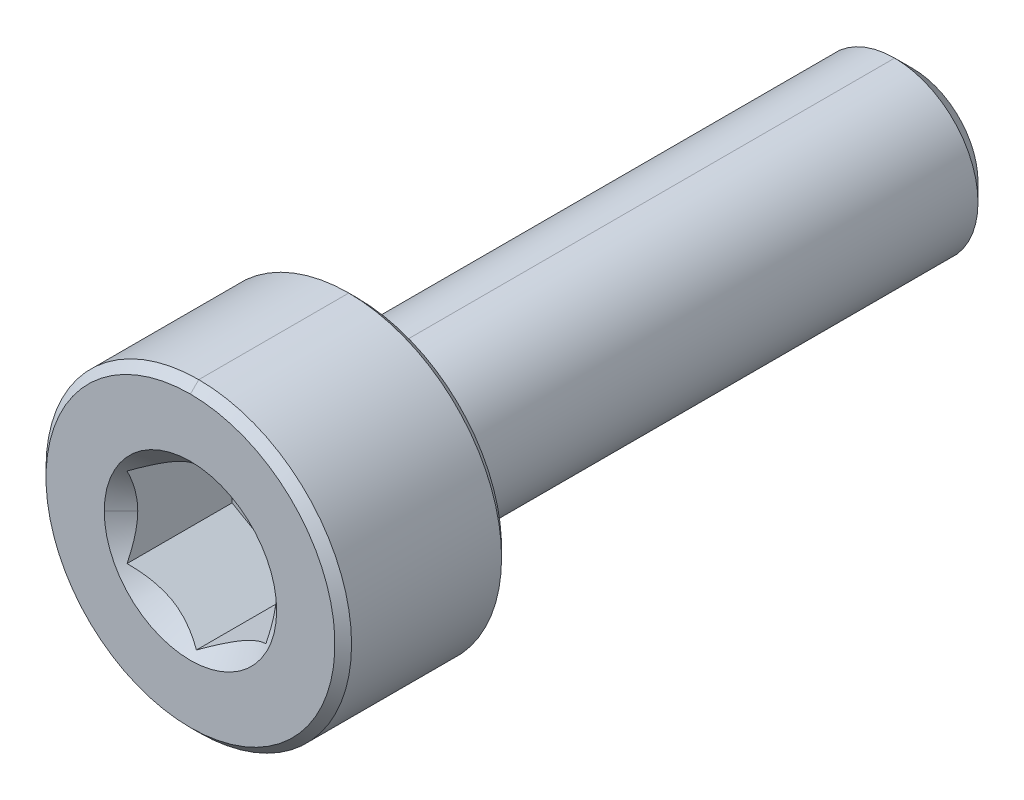
ISO-10303-21;
HEADER;
FILE_DESCRIPTION(('STEP AP214'),'2;1');
FILE_NAME('part.step','',(''),(''),'','','');
FILE_SCHEMA(('AUTOMOTIVE_DESIGN { 1 0 10303 214 1 1 1 1 }'));
ENDSEC;
DATA;
#1=APPLICATION_CONTEXT('core data for automotive mechanical design processes');
#2=APPLICATION_PROTOCOL_DEFINITION('international standard','automotive_design',2000,#1);
#3=PRODUCT_CONTEXT('',#1,'mechanical');
#4=PRODUCT('Part','Part','',(#3));
#5=PRODUCT_RELATED_PRODUCT_CATEGORY('part','',(#4));
#6=PRODUCT_DEFINITION_FORMATION('','',#4);
#7=PRODUCT_DEFINITION_CONTEXT('part definition',#1,'design');
#8=PRODUCT_DEFINITION('design','',#6,#7);
#9=PRODUCT_DEFINITION_SHAPE('','',#8);
#10=(LENGTH_UNIT() NAMED_UNIT(*) SI_UNIT(.MILLI.,.METRE.));
#11=(NAMED_UNIT(*) PLANE_ANGLE_UNIT() SI_UNIT($,.RADIAN.));
#12=(NAMED_UNIT(*) SI_UNIT($,.STERADIAN.) SOLID_ANGLE_UNIT());
#13=UNCERTAINTY_MEASURE_WITH_UNIT(LENGTH_MEASURE(1.E-05),#10,'distance_accuracy_value','');
#14=(GEOMETRIC_REPRESENTATION_CONTEXT(3) GLOBAL_UNCERTAINTY_ASSIGNED_CONTEXT((#13)) GLOBAL_UNIT_ASSIGNED_CONTEXT((#10,
#11,#12)) REPRESENTATION_CONTEXT('',''));
#15=CARTESIAN_POINT('',(0.,0.,0.));
#16=DIRECTION('',(0.,0.,1.));
#17=DIRECTION('',(1.,0.,0.));
#18=AXIS2_PLACEMENT_3D('',#15,#16,#17);
#19=CARTESIAN_POINT('',(1.25,-0.721687836487032,-0.318813079129866));
#20=DIRECTION('',(1.,0.,0.));
#21=DIRECTION('',(0.,-1.,0.));
#22=AXIS2_PLACEMENT_3D('',#19,#20,#21);
#23=PLANE('',#22);
#24=DIRECTION('',(0.,0.,1.));
#25=VECTOR('',#24,1.);
#26=CARTESIAN_POINT('',(1.25,-0.721687836487032,-0.318813079129866));
#27=LINE('',#26,#25);
#28=CARTESIAN_POINT('',(1.25,-0.721687836487032,4.5));
#29=VERTEX_POINT('',#28);
#30=CARTESIAN_POINT('',(1.25,-0.721687836487032,6.39174682452695));
#31=VERTEX_POINT('',#30);
#32=EDGE_CURVE('E467',#29,#31,#27,.T.);
#33=ORIENTED_EDGE('',*,*,#32,.T.);
#34=CARTESIAN_POINT('',(1.25,-0.721687836487032,6.39174682452694));
#35=CARTESIAN_POINT('',(1.25,-0.334936490538911,6.19837115155288));
#36=CARTESIAN_POINT('',(1.25,0.,6.19837115155288));
#37=B_SPLINE_CURVE_WITH_KNOTS('',2,(#34,#35,#36),.UNSPECIFIED.,.F.,.F.,(3,3),(0.,1.),.UNSPECIFIED.);
#38=CARTESIAN_POINT('',(1.25,0.,6.19837115155288));
#39=VERTEX_POINT('',#38);
#40=EDGE_CURVE('E470',#31,#39,#37,.T.);
#41=ORIENTED_EDGE('',*,*,#40,.T.);
#42=CARTESIAN_POINT('',(1.25,0.,6.19837115155288));
#43=CARTESIAN_POINT('',(1.25,0.180809106046994,6.19837115155288));
#44=CARTESIAN_POINT('',(1.25,0.371449563482302,6.25239368901567));
#45=CARTESIAN_POINT('',(1.25,0.536554357052858,6.29918008480986));
#46=CARTESIAN_POINT('',(1.25,0.721687836487032,6.39174682452694));
#47=B_SPLINE_CURVE_WITH_KNOTS('',2,(#42,#43,#44,#45,#46),.UNSPECIFIED.,.F.,.F.,(3,2,3),(0.,0.5,
1.),.UNSPECIFIED.);
#48=CARTESIAN_POINT('',(1.25,0.721687836487032,6.39174682452695));
#49=VERTEX_POINT('',#48);
#50=EDGE_CURVE('E269',#39,#49,#47,.T.);
#51=ORIENTED_EDGE('',*,*,#50,.T.);
#52=DIRECTION('',(0.,0.,1.));
#53=VECTOR('',#52,1.);
#54=CARTESIAN_POINT('',(1.25,0.721687836487032,-0.318813079129866));
#55=LINE('',#54,#53);
#56=CARTESIAN_POINT('',(1.25,0.721687836487032,4.5));
#57=VERTEX_POINT('',#56);
#58=EDGE_CURVE('E10',#57,#49,#55,.T.);
#59=ORIENTED_EDGE('',*,*,#58,.F.);
#60=DIRECTION('',(0.,1.,0.));
#61=VECTOR('',#60,1.);
#62=CARTESIAN_POINT('',(1.25,-0.721687836487032,4.5));
#63=LINE('',#62,#61);
#64=EDGE_CURVE('E268',#29,#57,#63,.T.);
#65=ORIENTED_EDGE('',*,*,#64,.F.);
#66=EDGE_LOOP('',(#33,#41,#51,#59,#65));
#67=FACE_BOUND('',#66,.T.);
#68=ADVANCED_FACE('F15',(#67),#23,.F.);
#69=CARTESIAN_POINT('',(1.25,0.721687836487032,-0.318813079129866));
#70=DIRECTION('',(0.5,0.866025403784439,0.));
#71=DIRECTION('',(0.,0.,-1.));
#72=AXIS2_PLACEMENT_3D('',#69,#70,#71);
#73=PLANE('',#72);
#74=ORIENTED_EDGE('',*,*,#58,.T.);
#75=CARTESIAN_POINT('',(1.25,0.721687836487032,6.39174682452694));
#76=CARTESIAN_POINT('',(0.91656068727862,0.914199113445125,6.19923554756885));
#77=CARTESIAN_POINT('',(0.627302735621754,1.08120226969946,6.19837397959836));
#78=CARTESIAN_POINT('',(0.336432191071432,1.24913645689492,6.19750760844657));
#79=CARTESIAN_POINT('',(0.,1.44337567297406,6.39174682452694));
#80=B_SPLINE_CURVE_WITH_KNOTS('',2,(#75,#76,#77,#78,#79),.UNSPECIFIED.,.F.,.F.,(3,2,3),(0.,0.5,
1.),.UNSPECIFIED.);
#81=CARTESIAN_POINT('',(0.,1.44337567297406,6.39174682452695));
#82=VERTEX_POINT('',#81);
#83=EDGE_CURVE('E610',#49,#82,#80,.T.);
#84=ORIENTED_EDGE('',*,*,#83,.T.);
#85=DIRECTION('',(0.,0.,1.));
#86=VECTOR('',#85,1.);
#87=CARTESIAN_POINT('',(0.,1.44337567297406,-0.318813079129866));
#88=LINE('',#87,#86);
#89=CARTESIAN_POINT('',(0.,1.44337567297406,4.5));
#90=VERTEX_POINT('',#89);
#91=EDGE_CURVE('E27',#90,#82,#88,.T.);
#92=ORIENTED_EDGE('',*,*,#91,.F.);
#93=DIRECTION('',(-0.866025403784439,0.5,0.));
#94=VECTOR('',#93,1.);
#95=CARTESIAN_POINT('',(1.25,0.721687836487032,4.5));
#96=LINE('',#95,#94);
#97=EDGE_CURVE('E284',#57,#90,#96,.T.);
#98=ORIENTED_EDGE('',*,*,#97,.F.);
#99=EDGE_LOOP('',(#74,#84,#92,#98));
#100=FACE_BOUND('',#99,.T.);
#101=ADVANCED_FACE('F461',(#100),#73,.F.);
#102=CARTESIAN_POINT('',(0.,1.44337567297406,-0.318813079129866));
#103=DIRECTION('',(-0.5,0.866025403784439,0.));
#104=DIRECTION('',(0.,0.,1.));
#105=AXIS2_PLACEMENT_3D('',#102,#103,#104);
#106=PLANE('',#105);
#107=ORIENTED_EDGE('',*,*,#91,.T.);
#108=CARTESIAN_POINT('',(0.,1.44337567297406,6.39174682452694));
#109=CARTESIAN_POINT('',(-0.333439312720455,1.25086439601651,6.19923554756939));
#110=CARTESIAN_POINT('',(-0.622697264378245,1.08386123976164,6.19837397959836));
#111=CARTESIAN_POINT('',(-0.913567808927629,0.915927052566721,6.19750760844603));
#112=CARTESIAN_POINT('',(-1.25,0.721687836487032,6.39174682452694));
#113=B_SPLINE_CURVE_WITH_KNOTS('',2,(#108,#109,#110,#111,#112),.UNSPECIFIED.,.F.,.F.,(3,2,3),
(0.,0.5,1.),.UNSPECIFIED.);
#114=CARTESIAN_POINT('',(-1.25,0.721687836487032,6.39174682452695));
#115=VERTEX_POINT('',#114);
#116=EDGE_CURVE('E605',#82,#115,#113,.T.);
#117=ORIENTED_EDGE('',*,*,#116,.T.);
#118=DIRECTION('',(0.,0.,1.));
#119=VECTOR('',#118,1.);
#120=CARTESIAN_POINT('',(-1.25,0.721687836487032,-0.318813079129866));
#121=LINE('',#120,#119);
#122=CARTESIAN_POINT('',(-1.25,0.721687836487032,4.5));
#123=VERTEX_POINT('',#122);
#124=EDGE_CURVE('E52',#123,#115,#121,.T.);
#125=ORIENTED_EDGE('',*,*,#124,.F.);
#126=DIRECTION('',(-0.866025403784439,-0.5,0.));
#127=VECTOR('',#126,1.);
#128=CARTESIAN_POINT('',(0.,1.44337567297406,4.5));
#129=LINE('',#128,#127);
#130=EDGE_CURVE('E290',#90,#123,#129,.T.);
#131=ORIENTED_EDGE('',*,*,#130,.F.);
#132=EDGE_LOOP('',(#107,#117,#125,#131));
#133=FACE_BOUND('',#132,.T.);
#134=ADVANCED_FACE('F373',(#133),#106,.F.);
#135=CARTESIAN_POINT('',(-1.25,0.721687836487032,-0.318813079129866));
#136=DIRECTION('',(-1.,0.,0.));
#137=DIRECTION('',(0.,1.,0.));
#138=AXIS2_PLACEMENT_3D('',#135,#136,#137);
#139=PLANE('',#138);
#140=ORIENTED_EDGE('',*,*,#124,.T.);
#141=CARTESIAN_POINT('',(-1.25,0.721687836487032,6.39174682452694));
#142=CARTESIAN_POINT('',(-1.25,0.538824359635309,6.30031508610108));
#143=CARTESIAN_POINT('',(-1.25,0.371449563482303,6.25239368901567));
#144=CARTESIAN_POINT('',(-1.25,0.182765348383379,6.19837115155288));
#145=CARTESIAN_POINT('',(-1.25,0.,6.19837115155288));
#146=B_SPLINE_CURVE_WITH_KNOTS('',2,(#141,#142,#143,#144,#145),.UNSPECIFIED.,.F.,.F.,(3,2,3),
(0.,0.5,1.),.UNSPECIFIED.);
#147=CARTESIAN_POINT('',(-1.25,0.,6.19837115155288));
#148=VERTEX_POINT('',#147);
#149=EDGE_CURVE('E280',#115,#148,#146,.T.);
#150=ORIENTED_EDGE('',*,*,#149,.T.);
#151=CARTESIAN_POINT('',(-1.25,0.,6.19837115155288));
#152=CARTESIAN_POINT('',(-1.25,-0.33493649053891,6.19837115155288));
#153=CARTESIAN_POINT('',(-1.25,-0.721687836487032,6.39174682452694));
#154=B_SPLINE_CURVE_WITH_KNOTS('',2,(#151,#152,#153),.UNSPECIFIED.,.F.,.F.,(3,3),(0.,1.),.UNSPECIFIED.);
#155=CARTESIAN_POINT('',(-1.25,-0.721687836487032,6.39174682452695));
#156=VERTEX_POINT('',#155);
#157=EDGE_CURVE('E392',#148,#156,#154,.T.);
#158=ORIENTED_EDGE('',*,*,#157,.T.);
#159=DIRECTION('',(0.,0.,1.));
#160=VECTOR('',#159,1.);
#161=CARTESIAN_POINT('',(-1.25,-0.721687836487032,-0.318813079129866));
#162=LINE('',#161,#160);
#163=CARTESIAN_POINT('',(-1.25,-0.721687836487033,4.5));
#164=VERTEX_POINT('',#163);
#165=EDGE_CURVE('E41',#164,#156,#162,.T.);
#166=ORIENTED_EDGE('',*,*,#165,.F.);
#167=DIRECTION('',(0.,-1.,0.));
#168=VECTOR('',#167,1.);
#169=CARTESIAN_POINT('',(-1.25,0.721687836487032,4.5));
#170=LINE('',#169,#168);
#171=EDGE_CURVE('E285',#123,#164,#170,.T.);
#172=ORIENTED_EDGE('',*,*,#171,.F.);
#173=EDGE_LOOP('',(#140,#150,#158,#166,#172));
#174=FACE_BOUND('',#173,.T.);
#175=ADVANCED_FACE('F363',(#174),#139,.F.);
#176=CARTESIAN_POINT('',(-1.25,-0.721687836487032,-0.318813079129866));
#177=DIRECTION('',(-0.5,-0.866025403784439,0.));
#178=DIRECTION('',(-0.866025403784439,0.5,0.));
#179=AXIS2_PLACEMENT_3D('',#176,#177,#178);
#180=PLANE('',#179);
#181=ORIENTED_EDGE('',*,*,#165,.T.);
#182=CARTESIAN_POINT('',(-1.25,-0.721687836487032,6.39174682452695));
#183=CARTESIAN_POINT('',(-0.916560687277681,-0.914199113445667,6.19923554756832));
#184=CARTESIAN_POINT('',(-0.627302735621755,-1.08120226969945,6.19837397959838));
#185=CARTESIAN_POINT('',(-0.336432191070502,-1.24913645689545,6.19750760844712));
#186=CARTESIAN_POINT('',(0.,-1.44337567297406,6.39174682452695));
#187=B_SPLINE_CURVE_WITH_KNOTS('',2,(#182,#183,#184,#185,#186),.UNSPECIFIED.,.F.,.F.,(3,2,3),
(0.,0.5,1.),.UNSPECIFIED.);
#188=CARTESIAN_POINT('',(0.,-1.44337567297406,6.39174682452695));
#189=VERTEX_POINT('',#188);
#190=EDGE_CURVE('E398',#156,#189,#187,.T.);
#191=ORIENTED_EDGE('',*,*,#190,.T.);
#192=DIRECTION('',(0.,0.,1.));
#193=VECTOR('',#192,1.);
#194=CARTESIAN_POINT('',(0.,-1.44337567297406,-0.318813079129866));
#195=LINE('',#194,#193);
#196=CARTESIAN_POINT('',(0.,-1.44337567297406,4.5));
#197=VERTEX_POINT('',#196);
#198=EDGE_CURVE('E294',#197,#189,#195,.T.);
#199=ORIENTED_EDGE('',*,*,#198,.F.);
#200=DIRECTION('',(0.866025403784439,-0.5,0.));
#201=VECTOR('',#200,1.);
#202=CARTESIAN_POINT('',(-1.25,-0.721687836487032,4.5));
#203=LINE('',#202,#201);
#204=EDGE_CURVE('E289',#164,#197,#203,.T.);
#205=ORIENTED_EDGE('',*,*,#204,.F.);
#206=EDGE_LOOP('',(#181,#191,#199,#205));
#207=FACE_BOUND('',#206,.T.);
#208=ADVANCED_FACE('F372',(#207),#180,.F.);
#209=CARTESIAN_POINT('',(0.,-1.44337567297406,-0.318813079129866));
#210=DIRECTION('',(0.5,-0.866025403784439,0.));
#211=DIRECTION('',(0.,0.,-1.));
#212=AXIS2_PLACEMENT_3D('',#209,#210,#211);
#213=PLANE('',#212);
#214=ORIENTED_EDGE('',*,*,#198,.T.);
#215=CARTESIAN_POINT('',(0.,-1.44337567297406,6.39174682452694));
#216=CARTESIAN_POINT('',(0.33343931272232,-1.25086439601543,6.19923554756831));
#217=CARTESIAN_POINT('',(0.622697264378245,-1.08386123976164,6.19837397959836));
#218=CARTESIAN_POINT('',(0.9135678089295,-0.915927052565641,6.1975076084471));
#219=CARTESIAN_POINT('',(1.25,-0.721687836487032,6.39174682452694));
#220=B_SPLINE_CURVE_WITH_KNOTS('',2,(#215,#216,#217,#218,#219),.UNSPECIFIED.,.F.,.F.,(3,2,3),
(0.,0.5,1.),.UNSPECIFIED.);
#221=EDGE_CURVE('E477',#189,#31,#220,.T.);
#222=ORIENTED_EDGE('',*,*,#221,.T.);
#223=ORIENTED_EDGE('',*,*,#32,.F.);
#224=DIRECTION('',(0.866025403784439,0.5,0.));
#225=VECTOR('',#224,1.);
#226=CARTESIAN_POINT('',(0.,-1.44337567297406,4.5));
#227=LINE('',#226,#225);
#228=EDGE_CURVE('E264',#197,#29,#227,.T.);
#229=ORIENTED_EDGE('',*,*,#228,.F.);
#230=EDGE_LOOP('',(#214,#222,#223,#229));
#231=FACE_BOUND('',#230,.T.);
#232=ADVANCED_FACE('F374',(#231),#213,.F.);
#233=CARTESIAN_POINT('',(0.,2.6,4.5));
#234=DIRECTION('',(0.,0.,-1.));
#235=DIRECTION('',(-1.,0.,0.));
#236=AXIS2_PLACEMENT_3D('',#233,#234,#235);
#237=PLANE('',#236);
#238=ORIENTED_EDGE('',*,*,#228,.T.);
#239=ORIENTED_EDGE('',*,*,#64,.T.);
#240=ORIENTED_EDGE('',*,*,#97,.T.);
#241=ORIENTED_EDGE('',*,*,#130,.T.);
#242=ORIENTED_EDGE('',*,*,#171,.T.);
#243=ORIENTED_EDGE('',*,*,#204,.T.);
#244=EDGE_LOOP('',(#238,#239,#240,#241,#242,#243));
#245=FACE_BOUND('',#244,.T.);
#246=ADVANCED_FACE('F328',(#245),#237,.F.);
#247=CARTESIAN_POINT('',(0.,0.,6.5));
#248=DIRECTION('',(0.,0.,1.));
#249=DIRECTION('',(1.,0.,0.));
#250=AXIS2_PLACEMENT_3D('',#247,#248,#249);
#251=CONICAL_SURFACE('',#250,1.55162884844712,0.78539816339745);
#252=DIRECTION('',(-0.707106781186549,0.,0.707106781186546));
#253=VECTOR('',#252,1.);
#254=CARTESIAN_POINT('',(-1.55162884844712,0.,6.5));
#255=LINE('',#254,#253);
#256=CARTESIAN_POINT('',(-1.55162884844712,0.,6.5));
#257=VERTEX_POINT('',#256);
#258=EDGE_CURVE('E395',#148,#257,#255,.T.);
#259=ORIENTED_EDGE('',*,*,#258,.F.);
#260=ORIENTED_EDGE('',*,*,#149,.F.);
#261=ORIENTED_EDGE('',*,*,#116,.F.);
#262=ORIENTED_EDGE('',*,*,#83,.F.);
#263=ORIENTED_EDGE('',*,*,#50,.F.);
#264=DIRECTION('',(0.707106781186549,0.,0.707106781186546));
#265=VECTOR('',#264,1.);
#266=CARTESIAN_POINT('',(1.55162884844712,0.,6.5));
#267=LINE('',#266,#265);
#268=CARTESIAN_POINT('',(1.55162884844712,0.,6.5));
#269=VERTEX_POINT('',#268);
#270=EDGE_CURVE('E315',#39,#269,#267,.T.);
#271=ORIENTED_EDGE('',*,*,#270,.T.);
#272=CARTESIAN_POINT('',(0.,0.,6.5));
#273=DIRECTION('',(0.,0.,1.));
#274=DIRECTION('',(1.,0.,0.));
#275=AXIS2_PLACEMENT_3D('',#272,#273,#274);
#276=CIRCLE('',#275,1.55162884844712);
#277=EDGE_CURVE('E277',#269,#257,#276,.T.);
#278=ORIENTED_EDGE('',*,*,#277,.T.);
#279=EDGE_LOOP('',(#259,#260,#261,#262,#263,#271,#278));
#280=FACE_BOUND('',#279,.T.);
#281=ADVANCED_FACE('F317',(#280),#251,.F.);
#282=CARTESIAN_POINT('',(0.,0.,6.5));
#283=DIRECTION('',(0.,0.,1.));
#284=DIRECTION('',(0.,-1.,0.));
#285=AXIS2_PLACEMENT_3D('',#282,#283,#284);
#286=PLANE('',#285);
#287=ORIENTED_EDGE('',*,*,#277,.F.);
#288=CARTESIAN_POINT('',(0.,0.,6.5));
#289=DIRECTION('',(0.,0.,1.));
#290=DIRECTION('',(1.,0.,0.));
#291=AXIS2_PLACEMENT_3D('',#288,#289,#290);
#292=CIRCLE('',#291,1.55162884844712);
#293=EDGE_CURVE('E406',#257,#269,#292,.T.);
#294=ORIENTED_EDGE('',*,*,#293,.F.);
#295=EDGE_LOOP('',(#287,#294));
#296=FACE_BOUND('',#295,.T.);
#297=CARTESIAN_POINT('',(0.,0.,6.5));
#298=DIRECTION('',(0.,0.,-1.));
#299=DIRECTION('',(0.,1.,0.));
#300=AXIS2_PLACEMENT_3D('',#297,#298,#299);
#301=CIRCLE('',#300,2.6);
#302=CARTESIAN_POINT('',(0.,2.6,6.5));
#303=VERTEX_POINT('',#302);
#304=CARTESIAN_POINT('',(0.,-2.6,6.5));
#305=VERTEX_POINT('',#304);
#306=EDGE_CURVE('E1045',#303,#305,#301,.T.);
#307=ORIENTED_EDGE('',*,*,#306,.F.);
#308=CARTESIAN_POINT('',(0.,0.,6.5));
#309=DIRECTION('',(0.,0.,-1.));
#310=DIRECTION('',(0.,1.,0.));
#311=AXIS2_PLACEMENT_3D('',#308,#309,#310);
#312=CIRCLE('',#311,2.6);
#313=EDGE_CURVE('E276',#305,#303,#312,.T.);
#314=ORIENTED_EDGE('',*,*,#313,.F.);
#315=EDGE_LOOP('',(#307,#314));
#316=FACE_BOUND('',#315,.T.);
#317=ADVANCED_FACE('F327',(#296,#316),#286,.T.);
#318=CARTESIAN_POINT('',(0.,0.,6.35));
#319=DIRECTION('',(0.,0.,-1.));
#320=DIRECTION('',(0.,1.,0.));
#321=AXIS2_PLACEMENT_3D('',#318,#319,#320);
#322=CONICAL_SURFACE('',#321,2.75,0.785398163397451);
#323=DIRECTION('',(0.,-0.70710678118655,-0.707106781186546));
#324=VECTOR('',#323,1.);
#325=CARTESIAN_POINT('',(0.,-2.75,6.35));
#326=LINE('',#325,#324);
#327=CARTESIAN_POINT('',(0.,-2.75,6.35));
#328=VERTEX_POINT('',#327);
#329=EDGE_CURVE('E1048',#305,#328,#326,.T.);
#330=ORIENTED_EDGE('',*,*,#329,.F.);
#331=ORIENTED_EDGE('',*,*,#313,.T.);
#332=DIRECTION('',(0.,0.70710678118655,-0.707106781186546));
#333=VECTOR('',#332,1.);
#334=CARTESIAN_POINT('',(0.,2.75,6.35));
#335=LINE('',#334,#333);
#336=CARTESIAN_POINT('',(0.,2.75,6.35));
#337=VERTEX_POINT('',#336);
#338=EDGE_CURVE('E211',#303,#337,#335,.T.);
#339=ORIENTED_EDGE('',*,*,#338,.T.);
#340=CARTESIAN_POINT('',(0.,0.,6.35));
#341=DIRECTION('',(0.,0.,-1.));
#342=DIRECTION('',(0.,1.,0.));
#343=AXIS2_PLACEMENT_3D('',#340,#341,#342);
#344=CIRCLE('',#343,2.75);
#345=EDGE_CURVE('E187',#328,#337,#344,.T.);
#346=ORIENTED_EDGE('',*,*,#345,.F.);
#347=EDGE_LOOP('',(#330,#331,#339,#346));
#348=FACE_BOUND('',#347,.T.);
#349=ADVANCED_FACE('F449',(#348),#322,.T.);
#350=CARTESIAN_POINT('',(0.,0.,-6.5));
#351=DIRECTION('',(0.,0.,-1.));
#352=DIRECTION('',(0.,1.,0.));
#353=AXIS2_PLACEMENT_3D('',#350,#351,#352);
#354=CYLINDRICAL_SURFACE('',#353,2.75);
#355=DIRECTION('',(0.,0.,-1.));
#356=VECTOR('',#355,1.);
#357=CARTESIAN_POINT('',(0.,-2.75,-6.5));
#358=LINE('',#357,#356);
#359=CARTESIAN_POINT('',(0.,-2.75,3.65));
#360=VERTEX_POINT('',#359);
#361=EDGE_CURVE('E178',#328,#360,#358,.T.);
#362=ORIENTED_EDGE('',*,*,#361,.F.);
#363=ORIENTED_EDGE('',*,*,#345,.T.);
#364=DIRECTION('',(0.,0.,-1.));
#365=VECTOR('',#364,1.);
#366=CARTESIAN_POINT('',(0.,2.75,-6.5));
#367=LINE('',#366,#365);
#368=CARTESIAN_POINT('',(0.,2.75,3.65));
#369=VERTEX_POINT('',#368);
#370=EDGE_CURVE('E181',#337,#369,#367,.T.);
#371=ORIENTED_EDGE('',*,*,#370,.T.);
#372=CARTESIAN_POINT('',(0.,0.,3.65));
#373=DIRECTION('',(0.,0.,-1.));
#374=DIRECTION('',(0.,1.,0.));
#375=AXIS2_PLACEMENT_3D('',#372,#373,#374);
#376=CIRCLE('',#375,2.75);
#377=EDGE_CURVE('E174',#360,#369,#376,.T.);
#378=ORIENTED_EDGE('',*,*,#377,.F.);
#379=EDGE_LOOP('',(#362,#363,#371,#378));
#380=FACE_BOUND('',#379,.T.);
#381=ADVANCED_FACE('F176',(#380),#354,.T.);
#382=CARTESIAN_POINT('',(0.,0.,3.5));
#383=DIRECTION('',(0.,0.,1.));
#384=DIRECTION('',(0.,-1.,0.));
#385=AXIS2_PLACEMENT_3D('',#382,#383,#384);
#386=CONICAL_SURFACE('',#385,2.6,0.785398163397446);
#387=DIRECTION('',(0.,0.707106781186546,0.70710678118655));
#388=VECTOR('',#387,1.);
#389=CARTESIAN_POINT('',(0.,2.6,3.5));
#390=LINE('',#389,#388);
#391=CARTESIAN_POINT('',(0.,2.6,3.5));
#392=VERTEX_POINT('',#391);
#393=EDGE_CURVE('E199',#392,#369,#390,.T.);
#394=ORIENTED_EDGE('',*,*,#393,.F.);
#395=CARTESIAN_POINT('',(0.,0.,3.5));
#396=DIRECTION('',(0.,0.,-1.));
#397=DIRECTION('',(0.,1.,0.));
#398=AXIS2_PLACEMENT_3D('',#395,#396,#397);
#399=CIRCLE('',#398,2.6);
#400=CARTESIAN_POINT('',(0.,-2.6,3.5));
#401=VERTEX_POINT('',#400);
#402=EDGE_CURVE('E188',#401,#392,#399,.T.);
#403=ORIENTED_EDGE('',*,*,#402,.F.);
#404=DIRECTION('',(0.,-0.707106781186546,0.70710678118655));
#405=VECTOR('',#404,1.);
#406=CARTESIAN_POINT('',(0.,-2.6,3.5));
#407=LINE('',#406,#405);
#408=EDGE_CURVE('E191',#401,#360,#407,.T.);
#409=ORIENTED_EDGE('',*,*,#408,.T.);
#410=ORIENTED_EDGE('',*,*,#377,.T.);
#411=EDGE_LOOP('',(#394,#403,#409,#410));
#412=FACE_BOUND('',#411,.T.);
#413=ADVANCED_FACE('F193',(#412),#386,.T.);
#414=CARTESIAN_POINT('',(0.,2.6,3.5));
#415=DIRECTION('',(0.,0.,-1.));
#416=DIRECTION('',(-1.,0.,0.));
#417=AXIS2_PLACEMENT_3D('',#414,#415,#416);
#418=PLANE('',#417);
#419=CARTESIAN_POINT('',(0.,0.,3.5));
#420=DIRECTION('',(0.,0.,-1.));
#421=DIRECTION('',(0.,1.,0.));
#422=AXIS2_PLACEMENT_3D('',#419,#420,#421);
#423=CIRCLE('',#422,1.65);
#424=CARTESIAN_POINT('',(0.,1.65,3.5));
#425=VERTEX_POINT('',#424);
#426=CARTESIAN_POINT('',(0.,-1.65,3.5));
#427=VERTEX_POINT('',#426);
#428=EDGE_CURVE('E263',#425,#427,#423,.T.);
#429=ORIENTED_EDGE('',*,*,#428,.F.);
#430=CARTESIAN_POINT('',(0.,0.,3.5));
#431=DIRECTION('',(0.,0.,-1.));
#432=DIRECTION('',(0.,1.,0.));
#433=AXIS2_PLACEMENT_3D('',#430,#431,#432);
#434=CIRCLE('',#433,1.65);
#435=EDGE_CURVE('E222',#427,#425,#434,.T.);
#436=ORIENTED_EDGE('',*,*,#435,.F.);
#437=EDGE_LOOP('',(#429,#436));
#438=FACE_BOUND('',#437,.T.);
#439=ORIENTED_EDGE('',*,*,#402,.T.);
#440=CARTESIAN_POINT('',(0.,0.,3.5));
#441=DIRECTION('',(0.,0.,-1.));
#442=DIRECTION('',(0.,1.,0.));
#443=AXIS2_PLACEMENT_3D('',#440,#441,#442);
#444=CIRCLE('',#443,2.6);
#445=EDGE_CURVE('E542',#392,#401,#444,.T.);
#446=ORIENTED_EDGE('',*,*,#445,.T.);
#447=EDGE_LOOP('',(#439,#446));
#448=FACE_BOUND('',#447,.T.);
#449=ADVANCED_FACE('F437',(#438,#448),#418,.T.);
#450=CARTESIAN_POINT('',(0.,0.,3.35));
#451=DIRECTION('',(0.,0.,-1.));
#452=DIRECTION('',(0.,1.,0.));
#453=AXIS2_PLACEMENT_3D('',#450,#451,#452);
#454=TOROIDAL_SURFACE('',#453,1.65,0.15);
#455=CARTESIAN_POINT('',(0.,-1.65,3.35));
#456=DIRECTION('',(1.,0.,0.));
#457=DIRECTION('',(0.,1.,0.));
#458=AXIS2_PLACEMENT_3D('',#455,#456,#457);
#459=CIRCLE('',#458,0.15);
#460=CARTESIAN_POINT('',(0.,-1.5,3.35));
#461=VERTEX_POINT('',#460);
#462=EDGE_CURVE('E227',#461,#427,#459,.T.);
#463=ORIENTED_EDGE('',*,*,#462,.F.);
#464=CARTESIAN_POINT('',(0.,0.,3.35));
#465=DIRECTION('',(0.,0.,-1.));
#466=DIRECTION('',(0.,1.,0.));
#467=AXIS2_PLACEMENT_3D('',#464,#465,#466);
#468=CIRCLE('',#467,1.5);
#469=CARTESIAN_POINT('',(0.,1.5,3.35));
#470=VERTEX_POINT('',#469);
#471=EDGE_CURVE('E231',#470,#461,#468,.T.);
#472=ORIENTED_EDGE('',*,*,#471,.F.);
#473=CARTESIAN_POINT('',(0.,1.65,3.35));
#474=DIRECTION('',(-1.,0.,0.));
#475=DIRECTION('',(0.,0.,1.));
#476=AXIS2_PLACEMENT_3D('',#473,#474,#475);
#477=CIRCLE('',#476,0.15);
#478=EDGE_CURVE('E226',#470,#425,#477,.T.);
#479=ORIENTED_EDGE('',*,*,#478,.T.);
#480=ORIENTED_EDGE('',*,*,#428,.T.);
#481=EDGE_LOOP('',(#463,#472,#479,#480));
#482=FACE_BOUND('',#481,.T.);
#483=ADVANCED_FACE('F442',(#482),#454,.F.);
#484=CARTESIAN_POINT('',(0.,0.,-6.5));
#485=DIRECTION('',(0.,0.,-1.));
#486=DIRECTION('',(0.,1.,0.));
#487=AXIS2_PLACEMENT_3D('',#484,#485,#486);
#488=CYLINDRICAL_SURFACE('',#487,1.5);
#489=DIRECTION('',(0.,0.,-1.));
#490=VECTOR('',#489,1.);
#491=CARTESIAN_POINT('',(0.,-1.5,-6.5));
#492=LINE('',#491,#490);
#493=CARTESIAN_POINT('',(0.,-1.5,-6.17524047358084));
#494=VERTEX_POINT('',#493);
#495=EDGE_CURVE('E241',#461,#494,#492,.T.);
#496=ORIENTED_EDGE('',*,*,#495,.F.);
#497=CARTESIAN_POINT('',(0.,0.,3.35));
#498=DIRECTION('',(0.,0.,-1.));
#499=DIRECTION('',(0.,1.,0.));
#500=AXIS2_PLACEMENT_3D('',#497,#498,#499);
#501=CIRCLE('',#500,1.5);
#502=EDGE_CURVE('E198',#461,#470,#501,.T.);
#503=ORIENTED_EDGE('',*,*,#502,.T.);
#504=DIRECTION('',(0.,0.,-1.));
#505=VECTOR('',#504,1.);
#506=CARTESIAN_POINT('',(0.,1.5,-6.5));
#507=LINE('',#506,#505);
#508=CARTESIAN_POINT('',(0.,1.5,-6.17524047358084));
#509=VERTEX_POINT('',#508);
#510=EDGE_CURVE('E237',#470,#509,#507,.T.);
#511=ORIENTED_EDGE('',*,*,#510,.T.);
#512=CARTESIAN_POINT('',(0.,0.,-6.17524047358084));
#513=DIRECTION('',(0.,0.,-1.));
#514=DIRECTION('',(0.,1.,0.));
#515=AXIS2_PLACEMENT_3D('',#512,#513,#514);
#516=CIRCLE('',#515,1.5);
#517=EDGE_CURVE('E260',#494,#509,#516,.T.);
#518=ORIENTED_EDGE('',*,*,#517,.F.);
#519=EDGE_LOOP('',(#496,#503,#511,#518));
#520=FACE_BOUND('',#519,.T.);
#521=ADVANCED_FACE('F438',(#520),#488,.T.);
#522=CARTESIAN_POINT('',(0.,0.,-6.5));
#523=DIRECTION('',(0.,0.,1.));
#524=DIRECTION('',(0.,-1.,0.));
#525=AXIS2_PLACEMENT_3D('',#522,#523,#524);
#526=CONICAL_SURFACE('',#525,1.17524047358084,0.785398163397448);
#527=DIRECTION('',(0.,0.707106781186547,0.707106781186549));
#528=VECTOR('',#527,1.);
#529=CARTESIAN_POINT('',(0.,1.17524047358084,-6.5));
#530=LINE('',#529,#528);
#531=CARTESIAN_POINT('',(0.,1.17524047358084,-6.5));
#532=VERTEX_POINT('',#531);
#533=EDGE_CURVE('E236',#532,#509,#530,.T.);
#534=ORIENTED_EDGE('',*,*,#533,.F.);
#535=CARTESIAN_POINT('',(0.,0.,-6.5));
#536=DIRECTION('',(0.,0.,-1.));
#537=DIRECTION('',(0.,1.,0.));
#538=AXIS2_PLACEMENT_3D('',#535,#536,#537);
#539=CIRCLE('',#538,1.17524047358084);
#540=CARTESIAN_POINT('',(0.,-1.17524047358084,-6.5));
#541=VERTEX_POINT('',#540);
#542=EDGE_CURVE('E259',#541,#532,#539,.T.);
#543=ORIENTED_EDGE('',*,*,#542,.F.);
#544=DIRECTION('',(0.,-0.707106781186547,0.707106781186549));
#545=VECTOR('',#544,1.);
#546=CARTESIAN_POINT('',(0.,-1.17524047358084,-6.5));
#547=LINE('',#546,#545);
#548=EDGE_CURVE('E255',#541,#494,#547,.T.);
#549=ORIENTED_EDGE('',*,*,#548,.T.);
#550=ORIENTED_EDGE('',*,*,#517,.T.);
#551=EDGE_LOOP('',(#534,#543,#549,#550));
#552=FACE_BOUND('',#551,.T.);
#553=ADVANCED_FACE('F441',(#552),#526,.T.);
#554=CARTESIAN_POINT('',(0.,1.17524047358084,-6.5));
#555=DIRECTION('',(0.,0.,-1.));
#556=DIRECTION('',(-1.,0.,0.));
#557=AXIS2_PLACEMENT_3D('',#554,#555,#556);
#558=PLANE('',#557);
#559=ORIENTED_EDGE('',*,*,#542,.T.);
#560=CARTESIAN_POINT('',(0.,0.,-6.5));
#561=DIRECTION('',(0.,0.,-1.));
#562=DIRECTION('',(0.,1.,0.));
#563=AXIS2_PLACEMENT_3D('',#560,#561,#562);
#564=CIRCLE('',#563,1.17524047358084);
#565=EDGE_CURVE('E232',#532,#541,#564,.T.);
#566=ORIENTED_EDGE('',*,*,#565,.T.);
#567=EDGE_LOOP('',(#559,#566));
#568=FACE_BOUND('',#567,.T.);
#569=ADVANCED_FACE('F433',(#568),#558,.T.);
#570=CARTESIAN_POINT('',(0.,0.,-6.5));
#571=DIRECTION('',(0.,0.,1.));
#572=DIRECTION('',(0.,-1.,0.));
#573=AXIS2_PLACEMENT_3D('',#570,#571,#572);
#574=CONICAL_SURFACE('',#573,1.17524047358084,0.785398163397448);
#575=ORIENTED_EDGE('',*,*,#565,.F.);
#576=ORIENTED_EDGE('',*,*,#533,.T.);
#577=CARTESIAN_POINT('',(0.,0.,-6.17524047358084));
#578=DIRECTION('',(0.,0.,-1.));
#579=DIRECTION('',(0.,1.,0.));
#580=AXIS2_PLACEMENT_3D('',#577,#578,#579);
#581=CIRCLE('',#580,1.5);
#582=EDGE_CURVE('E245',#509,#494,#581,.T.);
#583=ORIENTED_EDGE('',*,*,#582,.T.);
#584=ORIENTED_EDGE('',*,*,#548,.F.);
#585=EDGE_LOOP('',(#575,#576,#583,#584));
#586=FACE_BOUND('',#585,.T.);
#587=ADVANCED_FACE('F672',(#586),#574,.T.);
#588=CARTESIAN_POINT('',(0.,0.,-6.5));
#589=DIRECTION('',(0.,0.,-1.));
#590=DIRECTION('',(0.,1.,0.));
#591=AXIS2_PLACEMENT_3D('',#588,#589,#590);
#592=CYLINDRICAL_SURFACE('',#591,1.5);
#593=ORIENTED_EDGE('',*,*,#471,.T.);
#594=ORIENTED_EDGE('',*,*,#495,.T.);
#595=ORIENTED_EDGE('',*,*,#582,.F.);
#596=ORIENTED_EDGE('',*,*,#510,.F.);
#597=EDGE_LOOP('',(#593,#594,#595,#596));
#598=FACE_BOUND('',#597,.T.);
#599=ADVANCED_FACE('F660',(#598),#592,.T.);
#600=CARTESIAN_POINT('',(0.,0.,3.35));
#601=DIRECTION('',(0.,0.,-1.));
#602=DIRECTION('',(0.,1.,0.));
#603=AXIS2_PLACEMENT_3D('',#600,#601,#602);
#604=TOROIDAL_SURFACE('',#603,1.65,0.15);
#605=ORIENTED_EDGE('',*,*,#502,.F.);
#606=ORIENTED_EDGE('',*,*,#462,.T.);
#607=ORIENTED_EDGE('',*,*,#435,.T.);
#608=ORIENTED_EDGE('',*,*,#478,.F.);
#609=EDGE_LOOP('',(#605,#606,#607,#608));
#610=FACE_BOUND('',#609,.T.);
#611=ADVANCED_FACE('F656',(#610),#604,.F.);
#612=CARTESIAN_POINT('',(0.,0.,3.5));
#613=DIRECTION('',(0.,0.,1.));
#614=DIRECTION('',(0.,-1.,0.));
#615=AXIS2_PLACEMENT_3D('',#612,#613,#614);
#616=CONICAL_SURFACE('',#615,2.6,0.785398163397446);
#617=ORIENTED_EDGE('',*,*,#445,.F.);
#618=ORIENTED_EDGE('',*,*,#393,.T.);
#619=CARTESIAN_POINT('',(0.,0.,3.65));
#620=DIRECTION('',(0.,0.,-1.));
#621=DIRECTION('',(0.,1.,0.));
#622=AXIS2_PLACEMENT_3D('',#619,#620,#621);
#623=CIRCLE('',#622,2.75);
#624=EDGE_CURVE('E201',#369,#360,#623,.T.);
#625=ORIENTED_EDGE('',*,*,#624,.T.);
#626=ORIENTED_EDGE('',*,*,#408,.F.);
#627=EDGE_LOOP('',(#617,#618,#625,#626));
#628=FACE_BOUND('',#627,.T.);
#629=ADVANCED_FACE('F202',(#628),#616,.T.);
#630=CARTESIAN_POINT('',(0.,0.,-6.5));
#631=DIRECTION('',(0.,0.,-1.));
#632=DIRECTION('',(0.,1.,0.));
#633=AXIS2_PLACEMENT_3D('',#630,#631,#632);
#634=CYLINDRICAL_SURFACE('',#633,2.75);
#635=CARTESIAN_POINT('',(0.,0.,6.35));
#636=DIRECTION('',(0.,0.,-1.));
#637=DIRECTION('',(0.,1.,0.));
#638=AXIS2_PLACEMENT_3D('',#635,#636,#637);
#639=CIRCLE('',#638,2.75);
#640=EDGE_CURVE('E208',#337,#328,#639,.T.);
#641=ORIENTED_EDGE('',*,*,#640,.T.);
#642=ORIENTED_EDGE('',*,*,#361,.T.);
#643=ORIENTED_EDGE('',*,*,#624,.F.);
#644=ORIENTED_EDGE('',*,*,#370,.F.);
#645=EDGE_LOOP('',(#641,#642,#643,#644));
#646=FACE_BOUND('',#645,.T.);
#647=ADVANCED_FACE('F206',(#646),#634,.T.);
#648=CARTESIAN_POINT('',(0.,0.,6.35));
#649=DIRECTION('',(0.,0.,-1.));
#650=DIRECTION('',(0.,1.,0.));
#651=AXIS2_PLACEMENT_3D('',#648,#649,#650);
#652=CONICAL_SURFACE('',#651,2.75,0.785398163397451);
#653=ORIENTED_EDGE('',*,*,#306,.T.);
#654=ORIENTED_EDGE('',*,*,#329,.T.);
#655=ORIENTED_EDGE('',*,*,#640,.F.);
#656=ORIENTED_EDGE('',*,*,#338,.F.);
#657=EDGE_LOOP('',(#653,#654,#655,#656));
#658=FACE_BOUND('',#657,.T.);
#659=ADVANCED_FACE('F497',(#658),#652,.T.);
#660=CARTESIAN_POINT('',(0.,0.,6.5));
#661=DIRECTION('',(0.,0.,1.));
#662=DIRECTION('',(1.,0.,0.));
#663=AXIS2_PLACEMENT_3D('',#660,#661,#662);
#664=CONICAL_SURFACE('',#663,1.55162884844712,0.78539816339745);
#665=ORIENTED_EDGE('',*,*,#157,.F.);
#666=ORIENTED_EDGE('',*,*,#258,.T.);
#667=ORIENTED_EDGE('',*,*,#293,.T.);
#668=ORIENTED_EDGE('',*,*,#270,.F.);
#669=ORIENTED_EDGE('',*,*,#40,.F.);
#670=ORIENTED_EDGE('',*,*,#221,.F.);
#671=ORIENTED_EDGE('',*,*,#190,.F.);
#672=EDGE_LOOP('',(#665,#666,#667,#668,#669,#670,#671));
#673=FACE_BOUND('',#672,.T.);
#674=ADVANCED_FACE('F393',(#673),#664,.F.);
#675=CLOSED_SHELL('',(#68,#101,#134,#175,#208,#232,#246,#281,#317,#349,#381,#413,#449,#483,#521,
#553,#569,#587,#599,#611,#629,#647,#659,#674));
#676=MANIFOLD_SOLID_BREP('B1',#675);
#677=ADVANCED_BREP_SHAPE_REPRESENTATION('',(#18,#676),#14);
#678=SHAPE_DEFINITION_REPRESENTATION(#9,#677);
ENDSEC;
END-ISO-10303-21;
